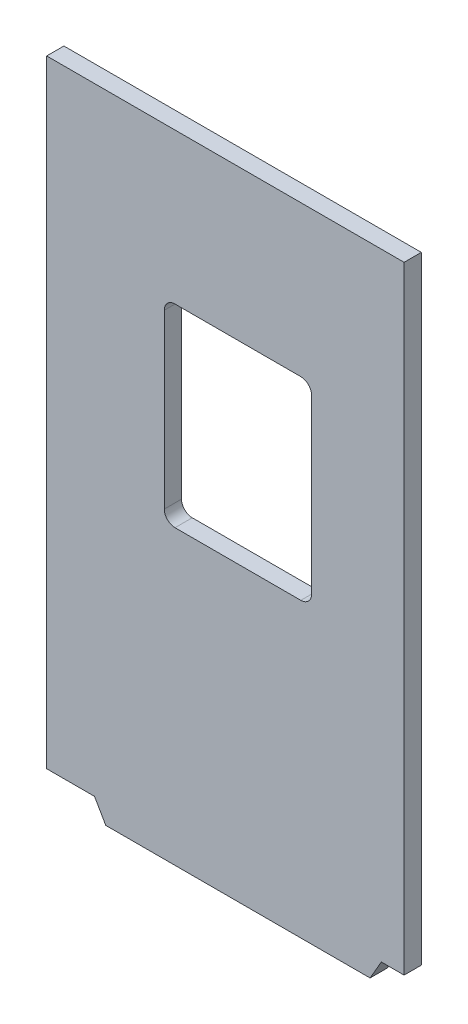
ISO-10303-21;
HEADER;
FILE_DESCRIPTION(('STEP AP214'),'2;1');
FILE_NAME('part.step','',(''),(''),'','','');
FILE_SCHEMA(('AUTOMOTIVE_DESIGN { 1 0 10303 214 1 1 1 1 }'));
ENDSEC;
DATA;
#1=APPLICATION_CONTEXT('core data for automotive mechanical design processes');
#2=APPLICATION_PROTOCOL_DEFINITION('international standard','automotive_design',2000,#1);
#3=PRODUCT_CONTEXT('',#1,'mechanical');
#4=PRODUCT('Part','Part','',(#3));
#5=PRODUCT_RELATED_PRODUCT_CATEGORY('part','',(#4));
#6=PRODUCT_DEFINITION_FORMATION('','',#4);
#7=PRODUCT_DEFINITION_CONTEXT('part definition',#1,'design');
#8=PRODUCT_DEFINITION('design','',#6,#7);
#9=PRODUCT_DEFINITION_SHAPE('','',#8);
#10=(LENGTH_UNIT() NAMED_UNIT(*) SI_UNIT(.MILLI.,.METRE.));
#11=(NAMED_UNIT(*) PLANE_ANGLE_UNIT() SI_UNIT($,.RADIAN.));
#12=(NAMED_UNIT(*) SI_UNIT($,.STERADIAN.) SOLID_ANGLE_UNIT());
#13=UNCERTAINTY_MEASURE_WITH_UNIT(LENGTH_MEASURE(1.E-05),#10,'distance_accuracy_value','');
#14=(GEOMETRIC_REPRESENTATION_CONTEXT(3) GLOBAL_UNCERTAINTY_ASSIGNED_CONTEXT((#13)) GLOBAL_UNIT_ASSIGNED_CONTEXT((#10,
#11,#12)) REPRESENTATION_CONTEXT('',''));
#15=CARTESIAN_POINT('',(0.,0.,0.));
#16=DIRECTION('',(0.,0.,1.));
#17=DIRECTION('',(1.,0.,0.));
#18=AXIS2_PLACEMENT_3D('',#15,#16,#17);
#19=CARTESIAN_POINT('',(10.,15.,1.6));
#20=DIRECTION('',(-1.,0.,0.));
#21=DIRECTION('',(0.,-1.,0.));
#22=AXIS2_PLACEMENT_3D('',#19,#20,#21);
#23=PLANE('',#22);
#24=DIRECTION('',(0.,1.,0.));
#25=VECTOR('',#24,1.);
#26=CARTESIAN_POINT('',(10.,15.,1.6));
#27=LINE('',#26,#25);
#28=CARTESIAN_POINT('',(10.,-13.1867599375903,1.60000000000001));
#29=VERTEX_POINT('',#28);
#30=CARTESIAN_POINT('',(10.,44.21,1.6));
#31=VERTEX_POINT('',#30);
#32=EDGE_CURVE('E161',#29,#31,#27,.T.);
#33=ORIENTED_EDGE('',*,*,#32,.F.);
#34=DIRECTION('',(0.,0.,-1.));
#35=VECTOR('',#34,1.);
#36=CARTESIAN_POINT('',(10.,-13.1867599375903,29.21));
#37=LINE('',#36,#35);
#38=CARTESIAN_POINT('',(10.,-13.1867599375903,0.));
#39=VERTEX_POINT('',#38);
#40=EDGE_CURVE('E147',#29,#39,#37,.T.);
#41=ORIENTED_EDGE('',*,*,#40,.T.);
#42=DIRECTION('',(0.,1.,0.));
#43=VECTOR('',#42,1.);
#44=CARTESIAN_POINT('',(10.,15.,0.));
#45=LINE('',#44,#43);
#46=CARTESIAN_POINT('',(10.,44.21,0.));
#47=VERTEX_POINT('',#46);
#48=EDGE_CURVE('E159',#39,#47,#45,.T.);
#49=ORIENTED_EDGE('',*,*,#48,.T.);
#50=DIRECTION('',(0.,0.,-1.));
#51=VECTOR('',#50,1.);
#52=CARTESIAN_POINT('',(10.,44.21,1.6));
#53=LINE('',#52,#51);
#54=EDGE_CURVE('E186',#31,#47,#53,.T.);
#55=ORIENTED_EDGE('',*,*,#54,.F.);
#56=EDGE_LOOP('',(#33,#41,#49,#55));
#57=FACE_BOUND('',#56,.T.);
#58=ADVANCED_FACE('F32',(#57),#23,.F.);
#59=CARTESIAN_POINT('',(-10.,-15.,1.6));
#60=DIRECTION('',(0.,1.,0.));
#61=DIRECTION('',(0.,0.,1.));
#62=AXIS2_PLACEMENT_3D('',#59,#60,#61);
#63=PLANE('',#62);
#64=DIRECTION('',(1.,0.,0.));
#65=VECTOR('',#64,1.);
#66=CARTESIAN_POINT('',(-10.,-15.,0.));
#67=LINE('',#66,#65);
#68=CARTESIAN_POINT('',(-17.736334457549,-15.,0.));
#69=VERTEX_POINT('',#68);
#70=CARTESIAN_POINT('',(6.83709508597291,-15.,0.));
#71=VERTEX_POINT('',#70);
#72=EDGE_CURVE('E167',#69,#71,#67,.T.);
#73=ORIENTED_EDGE('',*,*,#72,.T.);
#74=DIRECTION('',(0.,0.,-1.));
#75=VECTOR('',#74,1.);
#76=CARTESIAN_POINT('',(6.83709508597291,-15.,29.21));
#77=LINE('',#76,#75);
#78=CARTESIAN_POINT('',(6.83709508597291,-15.,1.60000000000001));
#79=VERTEX_POINT('',#78);
#80=EDGE_CURVE('E46',#79,#71,#77,.T.);
#81=ORIENTED_EDGE('',*,*,#80,.F.);
#82=DIRECTION('',(1.,0.,0.));
#83=VECTOR('',#82,1.);
#84=CARTESIAN_POINT('',(-10.,-15.,1.6));
#85=LINE('',#84,#83);
#86=CARTESIAN_POINT('',(-17.736334457549,-15.,1.60000000000001));
#87=VERTEX_POINT('',#86);
#88=EDGE_CURVE('E39',#87,#79,#85,.T.);
#89=ORIENTED_EDGE('',*,*,#88,.F.);
#90=DIRECTION('',(0.,0.,-1.));
#91=VECTOR('',#90,1.);
#92=CARTESIAN_POINT('',(-17.736334457549,-15.,29.21));
#93=LINE('',#92,#91);
#94=EDGE_CURVE('E154',#87,#69,#93,.T.);
#95=ORIENTED_EDGE('',*,*,#94,.T.);
#96=EDGE_LOOP('',(#73,#81,#89,#95));
#97=FACE_BOUND('',#96,.T.);
#98=ADVANCED_FACE('F275',(#97),#63,.F.);
#99=CARTESIAN_POINT('',(0.,0.,1.6));
#100=DIRECTION('',(0.,0.,1.));
#101=DIRECTION('',(1.,0.,0.));
#102=AXIS2_PLACEMENT_3D('',#99,#100,#101);
#103=PLANE('',#102);
#104=DIRECTION('',(-1.,0.,0.));
#105=VECTOR('',#104,1.);
#106=CARTESIAN_POINT('',(0.,-13.1867599375903,1.6));
#107=LINE('',#106,#105);
#108=CARTESIAN_POINT('',(7.88396971684608,-13.1867599375903,1.60000000000001));
#109=VERTEX_POINT('',#108);
#110=EDGE_CURVE('E234',#29,#109,#107,.T.);
#111=ORIENTED_EDGE('',*,*,#110,.F.);
#112=ORIENTED_EDGE('',*,*,#32,.T.);
#113=DIRECTION('',(1.,0.,0.));
#114=VECTOR('',#113,1.);
#115=CARTESIAN_POINT('',(-23.2296196845508,44.21,1.6));
#116=LINE('',#115,#114);
#117=CARTESIAN_POINT('',(-23.2296196845508,44.21,1.6));
#118=VERTEX_POINT('',#117);
#119=EDGE_CURVE('E179',#118,#31,#116,.T.);
#120=ORIENTED_EDGE('',*,*,#119,.F.);
#121=DIRECTION('',(0.,1.,0.));
#122=VECTOR('',#121,1.);
#123=CARTESIAN_POINT('',(-23.2296196845508,-15.,1.6));
#124=LINE('',#123,#122);
#125=CARTESIAN_POINT('',(-23.2296196845508,-13.1867599375903,1.6));
#126=VERTEX_POINT('',#125);
#127=EDGE_CURVE('E168',#126,#118,#124,.T.);
#128=ORIENTED_EDGE('',*,*,#127,.F.);
#129=DIRECTION('',(-1.,0.,0.));
#130=VECTOR('',#129,1.);
#131=CARTESIAN_POINT('',(0.,-13.1867599375902,1.6));
#132=LINE('',#131,#130);
#133=CARTESIAN_POINT('',(-18.7832090956866,-13.1867599375903,1.60000000000001));
#134=VERTEX_POINT('',#133);
#135=EDGE_CURVE('E53',#134,#126,#132,.T.);
#136=ORIENTED_EDGE('',*,*,#135,.F.);
#137=DIRECTION('',(-0.500000000000001,0.866025403784438,0.));
#138=VECTOR('',#137,1.);
#139=CARTESIAN_POINT('',(-19.797441371545,-11.4300581051274,1.6));
#140=LINE('',#139,#138);
#141=EDGE_CURVE('E256',#87,#134,#140,.T.);
#142=ORIENTED_EDGE('',*,*,#141,.F.);
#143=ORIENTED_EDGE('',*,*,#88,.T.);
#144=DIRECTION('',(-0.499999997397796,-0.866025405286822,0.));
#145=VECTOR('',#144,1.);
#146=CARTESIAN_POINT('',(11.6230118381187,-6.71054896696615,1.6));
#147=LINE('',#146,#145);
#148=EDGE_CURVE('E254',#109,#79,#147,.T.);
#149=ORIENTED_EDGE('',*,*,#148,.F.);
#150=EDGE_LOOP('',(#111,#112,#120,#128,#136,#142,#143,#149));
#151=FACE_BOUND('',#150,.T.);
#152=DIRECTION('',(0.,1.,0.));
#153=VECTOR('',#152,1.);
#154=CARTESIAN_POINT('',(-12.2980571845508,29.2,1.6));
#155=LINE('',#154,#153);
#156=CARTESIAN_POINT('',(-12.2980571845508,13.19,1.6));
#157=VERTEX_POINT('',#156);
#158=CARTESIAN_POINT('',(-12.2980571845508,29.2,1.6));
#159=VERTEX_POINT('',#158);
#160=EDGE_CURVE('E194',#157,#159,#155,.T.);
#161=ORIENTED_EDGE('',*,*,#160,.T.);
#162=CARTESIAN_POINT('',(-11.2980571845508,29.2,1.6));
#163=DIRECTION('',(0.,0.,1.));
#164=DIRECTION('',(1.,0.,0.));
#165=AXIS2_PLACEMENT_3D('',#162,#163,#164);
#166=CIRCLE('',#165,1.);
#167=CARTESIAN_POINT('',(-11.2980571845508,30.2,1.6));
#168=VERTEX_POINT('',#167);
#169=EDGE_CURVE('E193',#159,#168,#166,.F.);
#170=ORIENTED_EDGE('',*,*,#169,.T.);
#171=DIRECTION('',(1.,0.,0.));
#172=VECTOR('',#171,1.);
#173=CARTESIAN_POINT('',(0.398817815449215,30.2,1.6));
#174=LINE('',#173,#172);
#175=CARTESIAN_POINT('',(0.398817815449215,30.2,1.6));
#176=VERTEX_POINT('',#175);
#177=EDGE_CURVE('E197',#168,#176,#174,.T.);
#178=ORIENTED_EDGE('',*,*,#177,.T.);
#179=CARTESIAN_POINT('',(0.398817815449222,29.2,1.6));
#180=DIRECTION('',(0.,0.,1.));
#181=DIRECTION('',(1.,0.,0.));
#182=AXIS2_PLACEMENT_3D('',#179,#180,#181);
#183=CIRCLE('',#182,1.);
#184=CARTESIAN_POINT('',(1.39881781544922,29.2,1.6));
#185=VERTEX_POINT('',#184);
#186=EDGE_CURVE('E200',#176,#185,#183,.F.);
#187=ORIENTED_EDGE('',*,*,#186,.T.);
#188=DIRECTION('',(0.,-1.,0.));
#189=VECTOR('',#188,1.);
#190=CARTESIAN_POINT('',(1.39881781544922,13.19,1.6));
#191=LINE('',#190,#189);
#192=CARTESIAN_POINT('',(1.39881781544922,13.19,1.6));
#193=VERTEX_POINT('',#192);
#194=EDGE_CURVE('E203',#185,#193,#191,.T.);
#195=ORIENTED_EDGE('',*,*,#194,.T.);
#196=CARTESIAN_POINT('',(0.398817815449222,13.19,1.6));
#197=DIRECTION('',(0.,0.,1.));
#198=DIRECTION('',(1.,0.,0.));
#199=AXIS2_PLACEMENT_3D('',#196,#197,#198);
#200=CIRCLE('',#199,1.);
#201=CARTESIAN_POINT('',(0.398817815449215,12.19,1.6));
#202=VERTEX_POINT('',#201);
#203=EDGE_CURVE('E206',#193,#202,#200,.F.);
#204=ORIENTED_EDGE('',*,*,#203,.T.);
#205=DIRECTION('',(-1.,0.,0.));
#206=VECTOR('',#205,1.);
#207=CARTESIAN_POINT('',(-11.2980571845508,12.19,1.6));
#208=LINE('',#207,#206);
#209=CARTESIAN_POINT('',(-11.2980571845508,12.19,1.6));
#210=VERTEX_POINT('',#209);
#211=EDGE_CURVE('E209',#202,#210,#208,.T.);
#212=ORIENTED_EDGE('',*,*,#211,.T.);
#213=CARTESIAN_POINT('',(-11.2980571845508,13.19,1.6));
#214=DIRECTION('',(0.,0.,1.));
#215=DIRECTION('',(1.,0.,0.));
#216=AXIS2_PLACEMENT_3D('',#213,#214,#215);
#217=CIRCLE('',#216,0.999999999999999);
#218=EDGE_CURVE('E190',#210,#157,#217,.F.);
#219=ORIENTED_EDGE('',*,*,#218,.T.);
#220=EDGE_LOOP('',(#161,#170,#178,#187,#195,#204,#212,#219));
#221=FACE_BOUND('',#220,.T.);
#222=ADVANCED_FACE('F281',(#151,#221),#103,.T.);
#223=CARTESIAN_POINT('',(0.,0.,0.));
#224=DIRECTION('',(0.,0.,1.));
#225=DIRECTION('',(1.,0.,0.));
#226=AXIS2_PLACEMENT_3D('',#223,#224,#225);
#227=PLANE('',#226);
#228=CARTESIAN_POINT('',(-11.2980571845508,29.2,0.));
#229=DIRECTION('',(0.,0.,-1.));
#230=DIRECTION('',(1.,0.,0.));
#231=AXIS2_PLACEMENT_3D('',#228,#229,#230);
#232=CIRCLE('',#231,1.);
#233=CARTESIAN_POINT('',(-12.2980571845508,29.2,0.));
#234=VERTEX_POINT('',#233);
#235=CARTESIAN_POINT('',(-11.2980571845508,30.2,0.));
#236=VERTEX_POINT('',#235);
#237=EDGE_CURVE('E237',#234,#236,#232,.T.);
#238=ORIENTED_EDGE('',*,*,#237,.F.);
#239=DIRECTION('',(0.,1.,0.));
#240=VECTOR('',#239,1.);
#241=CARTESIAN_POINT('',(-12.2980571845508,29.2,0.));
#242=LINE('',#241,#240);
#243=CARTESIAN_POINT('',(-12.2980571845508,13.19,0.));
#244=VERTEX_POINT('',#243);
#245=EDGE_CURVE('E233',#244,#234,#242,.T.);
#246=ORIENTED_EDGE('',*,*,#245,.F.);
#247=CARTESIAN_POINT('',(-11.2980571845508,13.19,0.));
#248=DIRECTION('',(0.,0.,-1.));
#249=DIRECTION('',(1.,0.,0.));
#250=AXIS2_PLACEMENT_3D('',#247,#248,#249);
#251=CIRCLE('',#250,0.999999999999999);
#252=CARTESIAN_POINT('',(-11.2980571845508,12.19,0.));
#253=VERTEX_POINT('',#252);
#254=EDGE_CURVE('E230',#253,#244,#251,.T.);
#255=ORIENTED_EDGE('',*,*,#254,.F.);
#256=DIRECTION('',(-1.,0.,0.));
#257=VECTOR('',#256,1.);
#258=CARTESIAN_POINT('',(-11.2980571845508,12.19,0.));
#259=LINE('',#258,#257);
#260=CARTESIAN_POINT('',(0.398817815449215,12.19,0.));
#261=VERTEX_POINT('',#260);
#262=EDGE_CURVE('E229',#261,#253,#259,.T.);
#263=ORIENTED_EDGE('',*,*,#262,.F.);
#264=CARTESIAN_POINT('',(0.398817815449222,13.19,0.));
#265=DIRECTION('',(0.,0.,-1.));
#266=DIRECTION('',(-1.,0.,0.));
#267=AXIS2_PLACEMENT_3D('',#264,#265,#266);
#268=CIRCLE('',#267,1.);
#269=CARTESIAN_POINT('',(1.39881781544922,13.19,0.));
#270=VERTEX_POINT('',#269);
#271=EDGE_CURVE('E249',#270,#261,#268,.T.);
#272=ORIENTED_EDGE('',*,*,#271,.F.);
#273=DIRECTION('',(0.,-1.,0.));
#274=VECTOR('',#273,1.);
#275=CARTESIAN_POINT('',(1.39881781544922,13.19,0.));
#276=LINE('',#275,#274);
#277=CARTESIAN_POINT('',(1.39881781544922,29.2,0.));
#278=VERTEX_POINT('',#277);
#279=EDGE_CURVE('E246',#278,#270,#276,.T.);
#280=ORIENTED_EDGE('',*,*,#279,.F.);
#281=CARTESIAN_POINT('',(0.398817815449222,29.2,0.));
#282=DIRECTION('',(0.,0.,-1.));
#283=DIRECTION('',(1.,0.,0.));
#284=AXIS2_PLACEMENT_3D('',#281,#282,#283);
#285=CIRCLE('',#284,1.);
#286=CARTESIAN_POINT('',(0.398817815449215,30.2,0.));
#287=VERTEX_POINT('',#286);
#288=EDGE_CURVE('E243',#287,#278,#285,.T.);
#289=ORIENTED_EDGE('',*,*,#288,.F.);
#290=DIRECTION('',(1.,0.,0.));
#291=VECTOR('',#290,1.);
#292=CARTESIAN_POINT('',(0.398817815449215,30.2,0.));
#293=LINE('',#292,#291);
#294=EDGE_CURVE('E240',#236,#287,#293,.T.);
#295=ORIENTED_EDGE('',*,*,#294,.F.);
#296=EDGE_LOOP('',(#238,#246,#255,#263,#272,#280,#289,#295));
#297=FACE_BOUND('',#296,.T.);
#298=ORIENTED_EDGE('',*,*,#48,.F.);
#299=DIRECTION('',(1.,0.,0.));
#300=VECTOR('',#299,1.);
#301=CARTESIAN_POINT('',(10.,-13.1867599375903,0.));
#302=LINE('',#301,#300);
#303=CARTESIAN_POINT('',(7.88396971684608,-13.1867599375903,0.));
#304=VERTEX_POINT('',#303);
#305=EDGE_CURVE('E144',#304,#39,#302,.T.);
#306=ORIENTED_EDGE('',*,*,#305,.F.);
#307=DIRECTION('',(0.499999997397796,0.866025405286822,0.));
#308=VECTOR('',#307,1.);
#309=CARTESIAN_POINT('',(7.88396971684608,-13.1867599375903,0.));
#310=LINE('',#309,#308);
#311=EDGE_CURVE('E153',#71,#304,#310,.T.);
#312=ORIENTED_EDGE('',*,*,#311,.F.);
#313=ORIENTED_EDGE('',*,*,#72,.F.);
#314=DIRECTION('',(0.500000000000001,-0.866025403784438,0.));
#315=VECTOR('',#314,1.);
#316=CARTESIAN_POINT('',(-17.736334457549,-15.,0.));
#317=LINE('',#316,#315);
#318=CARTESIAN_POINT('',(-18.7832090956866,-13.1867599375903,0.));
#319=VERTEX_POINT('',#318);
#320=EDGE_CURVE('E266',#319,#69,#317,.T.);
#321=ORIENTED_EDGE('',*,*,#320,.F.);
#322=DIRECTION('',(1.,0.,0.));
#323=VECTOR('',#322,1.);
#324=CARTESIAN_POINT('',(-19.6396374699896,-13.1867599375903,0.));
#325=LINE('',#324,#323);
#326=CARTESIAN_POINT('',(-23.2296196845508,-13.1867599375903,0.));
#327=VERTEX_POINT('',#326);
#328=EDGE_CURVE('E261',#327,#319,#325,.T.);
#329=ORIENTED_EDGE('',*,*,#328,.F.);
#330=DIRECTION('',(0.,-1.,0.));
#331=VECTOR('',#330,1.);
#332=CARTESIAN_POINT('',(-23.2296196845508,15.,0.));
#333=LINE('',#332,#331);
#334=CARTESIAN_POINT('',(-23.2296196845508,44.21,0.));
#335=VERTEX_POINT('',#334);
#336=EDGE_CURVE('E171',#335,#327,#333,.T.);
#337=ORIENTED_EDGE('',*,*,#336,.F.);
#338=DIRECTION('',(-1.,0.,0.));
#339=VECTOR('',#338,1.);
#340=CARTESIAN_POINT('',(10.,44.21,0.));
#341=LINE('',#340,#339);
#342=EDGE_CURVE('E165',#47,#335,#341,.T.);
#343=ORIENTED_EDGE('',*,*,#342,.F.);
#344=EDGE_LOOP('',(#298,#306,#312,#313,#321,#329,#337,#343));
#345=FACE_BOUND('',#344,.T.);
#346=ADVANCED_FACE('F163',(#297,#345),#227,.F.);
#347=CARTESIAN_POINT('',(-23.2296196845508,0.,0.));
#348=DIRECTION('',(-1.,0.,0.));
#349=DIRECTION('',(0.,-1.,0.));
#350=AXIS2_PLACEMENT_3D('',#347,#348,#349);
#351=PLANE('',#350);
#352=DIRECTION('',(0.,0.,-1.));
#353=VECTOR('',#352,1.);
#354=CARTESIAN_POINT('',(-23.2296196845508,-13.1867599375903,0.));
#355=LINE('',#354,#353);
#356=EDGE_CURVE('E11',#126,#327,#355,.T.);
#357=ORIENTED_EDGE('',*,*,#356,.F.);
#358=ORIENTED_EDGE('',*,*,#127,.T.);
#359=DIRECTION('',(0.,0.,1.));
#360=VECTOR('',#359,1.);
#361=CARTESIAN_POINT('',(-23.2296196845508,44.21,0.));
#362=LINE('',#361,#360);
#363=EDGE_CURVE('E182',#335,#118,#362,.T.);
#364=ORIENTED_EDGE('',*,*,#363,.F.);
#365=ORIENTED_EDGE('',*,*,#336,.T.);
#366=EDGE_LOOP('',(#357,#358,#364,#365));
#367=FACE_BOUND('',#366,.T.);
#368=ADVANCED_FACE('F287',(#367),#351,.T.);
#369=CARTESIAN_POINT('',(0.,44.21,0.));
#370=DIRECTION('',(0.,1.,0.));
#371=DIRECTION('',(0.,0.,1.));
#372=AXIS2_PLACEMENT_3D('',#369,#370,#371);
#373=PLANE('',#372);
#374=ORIENTED_EDGE('',*,*,#54,.T.);
#375=ORIENTED_EDGE('',*,*,#342,.T.);
#376=ORIENTED_EDGE('',*,*,#363,.T.);
#377=ORIENTED_EDGE('',*,*,#119,.T.);
#378=EDGE_LOOP('',(#374,#375,#376,#377));
#379=FACE_BOUND('',#378,.T.);
#380=ADVANCED_FACE('F289',(#379),#373,.T.);
#381=CARTESIAN_POINT('',(-12.2980571845508,29.2,24.2266322011391));
#382=DIRECTION('',(-1.,0.,0.));
#383=DIRECTION('',(0.,0.,1.));
#384=AXIS2_PLACEMENT_3D('',#381,#382,#383);
#385=PLANE('',#384);
#386=DIRECTION('',(0.,0.,-1.));
#387=VECTOR('',#386,1.);
#388=CARTESIAN_POINT('',(-12.2980571845508,13.19,24.2266322011391));
#389=LINE('',#388,#387);
#390=EDGE_CURVE('E188',#157,#244,#389,.T.);
#391=ORIENTED_EDGE('',*,*,#390,.T.);
#392=ORIENTED_EDGE('',*,*,#245,.T.);
#393=DIRECTION('',(0.,0.,-1.));
#394=VECTOR('',#393,1.);
#395=CARTESIAN_POINT('',(-12.2980571845508,29.2,24.2266322011391));
#396=LINE('',#395,#394);
#397=EDGE_CURVE('E191',#159,#234,#396,.T.);
#398=ORIENTED_EDGE('',*,*,#397,.F.);
#399=ORIENTED_EDGE('',*,*,#160,.F.);
#400=EDGE_LOOP('',(#391,#392,#398,#399));
#401=FACE_BOUND('',#400,.T.);
#402=ADVANCED_FACE('F291',(#401),#385,.F.);
#403=CARTESIAN_POINT('',(-11.2980571845508,29.2,24.2266322011391));
#404=DIRECTION('',(0.,0.,-1.));
#405=DIRECTION('',(-1.,0.,0.));
#406=AXIS2_PLACEMENT_3D('',#403,#404,#405);
#407=CYLINDRICAL_SURFACE('',#406,1.);
#408=ORIENTED_EDGE('',*,*,#397,.T.);
#409=ORIENTED_EDGE('',*,*,#237,.T.);
#410=DIRECTION('',(0.,0.,-1.));
#411=VECTOR('',#410,1.);
#412=CARTESIAN_POINT('',(-11.2980571845508,30.2,24.2266322011391));
#413=LINE('',#412,#411);
#414=EDGE_CURVE('E195',#168,#236,#413,.T.);
#415=ORIENTED_EDGE('',*,*,#414,.F.);
#416=ORIENTED_EDGE('',*,*,#169,.F.);
#417=EDGE_LOOP('',(#408,#409,#415,#416));
#418=FACE_BOUND('',#417,.T.);
#419=ADVANCED_FACE('F297',(#418),#407,.F.);
#420=CARTESIAN_POINT('',(0.398817815449215,30.2,24.2266322011391));
#421=DIRECTION('',(0.,1.,0.));
#422=DIRECTION('',(0.,0.,1.));
#423=AXIS2_PLACEMENT_3D('',#420,#421,#422);
#424=PLANE('',#423);
#425=ORIENTED_EDGE('',*,*,#414,.T.);
#426=ORIENTED_EDGE('',*,*,#294,.T.);
#427=DIRECTION('',(0.,0.,-1.));
#428=VECTOR('',#427,1.);
#429=CARTESIAN_POINT('',(0.398817815449215,30.2,24.2266322011391));
#430=LINE('',#429,#428);
#431=EDGE_CURVE('E198',#176,#287,#430,.T.);
#432=ORIENTED_EDGE('',*,*,#431,.F.);
#433=ORIENTED_EDGE('',*,*,#177,.F.);
#434=EDGE_LOOP('',(#425,#426,#432,#433));
#435=FACE_BOUND('',#434,.T.);
#436=ADVANCED_FACE('F342',(#435),#424,.F.);
#437=CARTESIAN_POINT('',(0.398817815449222,29.2,24.2266322011391));
#438=DIRECTION('',(0.,0.,-1.));
#439=DIRECTION('',(-1.,0.,0.));
#440=AXIS2_PLACEMENT_3D('',#437,#438,#439);
#441=CYLINDRICAL_SURFACE('',#440,1.);
#442=ORIENTED_EDGE('',*,*,#431,.T.);
#443=ORIENTED_EDGE('',*,*,#288,.T.);
#444=DIRECTION('',(0.,0.,-1.));
#445=VECTOR('',#444,1.);
#446=CARTESIAN_POINT('',(1.39881781544922,29.2,24.2266322011391));
#447=LINE('',#446,#445);
#448=EDGE_CURVE('E201',#185,#278,#447,.T.);
#449=ORIENTED_EDGE('',*,*,#448,.F.);
#450=ORIENTED_EDGE('',*,*,#186,.F.);
#451=EDGE_LOOP('',(#442,#443,#449,#450));
#452=FACE_BOUND('',#451,.T.);
#453=ADVANCED_FACE('F339',(#452),#441,.F.);
#454=CARTESIAN_POINT('',(1.39881781544922,13.19,24.2266322011391));
#455=DIRECTION('',(1.,0.,0.));
#456=DIRECTION('',(0.,0.,-1.));
#457=AXIS2_PLACEMENT_3D('',#454,#455,#456);
#458=PLANE('',#457);
#459=ORIENTED_EDGE('',*,*,#448,.T.);
#460=ORIENTED_EDGE('',*,*,#279,.T.);
#461=DIRECTION('',(0.,0.,-1.));
#462=VECTOR('',#461,1.);
#463=CARTESIAN_POINT('',(1.39881781544922,13.19,24.2266322011391));
#464=LINE('',#463,#462);
#465=EDGE_CURVE('E204',#193,#270,#464,.T.);
#466=ORIENTED_EDGE('',*,*,#465,.F.);
#467=ORIENTED_EDGE('',*,*,#194,.F.);
#468=EDGE_LOOP('',(#459,#460,#466,#467));
#469=FACE_BOUND('',#468,.T.);
#470=ADVANCED_FACE('F336',(#469),#458,.F.);
#471=CARTESIAN_POINT('',(0.398817815449222,13.19,24.2266322011391));
#472=DIRECTION('',(0.,0.,-1.));
#473=DIRECTION('',(-1.,0.,0.));
#474=AXIS2_PLACEMENT_3D('',#471,#472,#473);
#475=CYLINDRICAL_SURFACE('',#474,1.);
#476=ORIENTED_EDGE('',*,*,#465,.T.);
#477=ORIENTED_EDGE('',*,*,#271,.T.);
#478=DIRECTION('',(0.,0.,-1.));
#479=VECTOR('',#478,1.);
#480=CARTESIAN_POINT('',(0.398817815449215,12.19,24.2266322011391));
#481=LINE('',#480,#479);
#482=EDGE_CURVE('E207',#202,#261,#481,.T.);
#483=ORIENTED_EDGE('',*,*,#482,.F.);
#484=ORIENTED_EDGE('',*,*,#203,.F.);
#485=EDGE_LOOP('',(#476,#477,#483,#484));
#486=FACE_BOUND('',#485,.T.);
#487=ADVANCED_FACE('F333',(#486),#475,.F.);
#488=CARTESIAN_POINT('',(-11.2980571845508,12.19,24.2266322011391));
#489=DIRECTION('',(0.,-1.,0.));
#490=DIRECTION('',(0.,0.,-1.));
#491=AXIS2_PLACEMENT_3D('',#488,#489,#490);
#492=PLANE('',#491);
#493=ORIENTED_EDGE('',*,*,#482,.T.);
#494=ORIENTED_EDGE('',*,*,#262,.T.);
#495=DIRECTION('',(0.,0.,-1.));
#496=VECTOR('',#495,1.);
#497=CARTESIAN_POINT('',(-11.2980571845508,12.19,24.2266322011391));
#498=LINE('',#497,#496);
#499=EDGE_CURVE('E210',#210,#253,#498,.T.);
#500=ORIENTED_EDGE('',*,*,#499,.F.);
#501=ORIENTED_EDGE('',*,*,#211,.F.);
#502=EDGE_LOOP('',(#493,#494,#500,#501));
#503=FACE_BOUND('',#502,.T.);
#504=ADVANCED_FACE('F330',(#503),#492,.F.);
#505=CARTESIAN_POINT('',(-11.2980571845508,13.19,24.2266322011391));
#506=DIRECTION('',(0.,0.,-1.));
#507=DIRECTION('',(-1.,0.,0.));
#508=AXIS2_PLACEMENT_3D('',#505,#506,#507);
#509=CYLINDRICAL_SURFACE('',#508,0.999999999999999);
#510=ORIENTED_EDGE('',*,*,#499,.T.);
#511=ORIENTED_EDGE('',*,*,#254,.T.);
#512=ORIENTED_EDGE('',*,*,#390,.F.);
#513=ORIENTED_EDGE('',*,*,#218,.F.);
#514=EDGE_LOOP('',(#510,#511,#512,#513));
#515=FACE_BOUND('',#514,.T.);
#516=ADVANCED_FACE('F324',(#515),#509,.F.);
#517=CARTESIAN_POINT('',(-19.6396374699896,-13.1867599375903,29.21));
#518=DIRECTION('',(0.,1.,0.));
#519=DIRECTION('',(-1.,0.,0.));
#520=AXIS2_PLACEMENT_3D('',#517,#518,#519);
#521=PLANE('',#520);
#522=ORIENTED_EDGE('',*,*,#135,.T.);
#523=ORIENTED_EDGE('',*,*,#356,.T.);
#524=ORIENTED_EDGE('',*,*,#328,.T.);
#525=DIRECTION('',(0.,0.,-1.));
#526=VECTOR('',#525,1.);
#527=CARTESIAN_POINT('',(-18.7832090956866,-13.1867599375903,29.21));
#528=LINE('',#527,#526);
#529=EDGE_CURVE('E259',#134,#319,#528,.T.);
#530=ORIENTED_EDGE('',*,*,#529,.F.);
#531=EDGE_LOOP('',(#522,#523,#524,#530));
#532=FACE_BOUND('',#531,.T.);
#533=ADVANCED_FACE('F360',(#532),#521,.F.);
#534=CARTESIAN_POINT('',(-17.736334457549,-15.,29.21));
#535=DIRECTION('',(0.866025403784438,0.500000000000001,0.));
#536=DIRECTION('',(-0.500000000000001,0.866025403784438,0.));
#537=AXIS2_PLACEMENT_3D('',#534,#535,#536);
#538=PLANE('',#537);
#539=ORIENTED_EDGE('',*,*,#141,.T.);
#540=ORIENTED_EDGE('',*,*,#529,.T.);
#541=ORIENTED_EDGE('',*,*,#320,.T.);
#542=ORIENTED_EDGE('',*,*,#94,.F.);
#543=EDGE_LOOP('',(#539,#540,#541,#542));
#544=FACE_BOUND('',#543,.T.);
#545=ADVANCED_FACE('F279',(#544),#538,.F.);
#546=CARTESIAN_POINT('',(10.,-13.1867599375903,29.21));
#547=DIRECTION('',(0.,1.,0.));
#548=DIRECTION('',(-1.,0.,0.));
#549=AXIS2_PLACEMENT_3D('',#546,#547,#548);
#550=PLANE('',#549);
#551=ORIENTED_EDGE('',*,*,#110,.T.);
#552=DIRECTION('',(0.,0.,-1.));
#553=VECTOR('',#552,1.);
#554=CARTESIAN_POINT('',(7.88396971684608,-13.1867599375903,29.21));
#555=LINE('',#554,#553);
#556=EDGE_CURVE('E150',#109,#304,#555,.T.);
#557=ORIENTED_EDGE('',*,*,#556,.T.);
#558=ORIENTED_EDGE('',*,*,#305,.T.);
#559=ORIENTED_EDGE('',*,*,#40,.F.);
#560=EDGE_LOOP('',(#551,#557,#558,#559));
#561=FACE_BOUND('',#560,.T.);
#562=ADVANCED_FACE('F146',(#561),#550,.F.);
#563=CARTESIAN_POINT('',(7.88396971684608,-13.1867599375903,29.21));
#564=DIRECTION('',(-0.866025405286822,0.499999997397796,0.));
#565=DIRECTION('',(-0.499999997397796,-0.866025405286822,0.));
#566=AXIS2_PLACEMENT_3D('',#563,#564,#565);
#567=PLANE('',#566);
#568=ORIENTED_EDGE('',*,*,#148,.T.);
#569=ORIENTED_EDGE('',*,*,#80,.T.);
#570=ORIENTED_EDGE('',*,*,#311,.T.);
#571=ORIENTED_EDGE('',*,*,#556,.F.);
#572=EDGE_LOOP('',(#568,#569,#570,#571));
#573=FACE_BOUND('',#572,.T.);
#574=ADVANCED_FACE('F270',(#573),#567,.F.);
#575=CLOSED_SHELL('',(#58,#98,#222,#346,#368,#380,#402,#419,#436,#453,#470,#487,#504,#516,#533,
#545,#562,#574));
#576=MANIFOLD_SOLID_BREP('B2',#575);
#577=ADVANCED_BREP_SHAPE_REPRESENTATION('',(#18,#576),#14);
#578=SHAPE_DEFINITION_REPRESENTATION(#9,#577);
ENDSEC;
END-ISO-10303-21;
